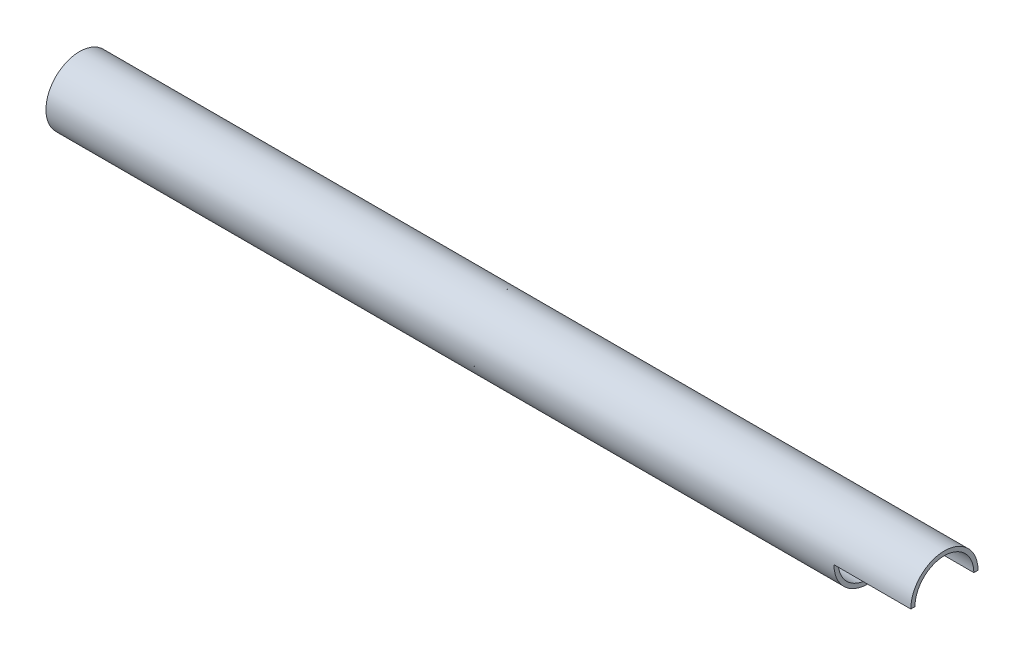
ISO-10303-21;
HEADER;
FILE_DESCRIPTION(('STEP AP214'),'2;1');
FILE_NAME('part.step','',(''),(''),'','','');
FILE_SCHEMA(('AUTOMOTIVE_DESIGN { 1 0 10303 214 1 1 1 1 }'));
ENDSEC;
DATA;
#1=APPLICATION_CONTEXT('core data for automotive mechanical design processes');
#2=APPLICATION_PROTOCOL_DEFINITION('international standard','automotive_design',2000,#1);
#3=PRODUCT_CONTEXT('',#1,'mechanical');
#4=PRODUCT('Part','Part','',(#3));
#5=PRODUCT_RELATED_PRODUCT_CATEGORY('part','',(#4));
#6=PRODUCT_DEFINITION_FORMATION('','',#4);
#7=PRODUCT_DEFINITION_CONTEXT('part definition',#1,'design');
#8=PRODUCT_DEFINITION('design','',#6,#7);
#9=PRODUCT_DEFINITION_SHAPE('','',#8);
#10=(LENGTH_UNIT() NAMED_UNIT(*) SI_UNIT(.MILLI.,.METRE.));
#11=(NAMED_UNIT(*) PLANE_ANGLE_UNIT() SI_UNIT($,.RADIAN.));
#12=(NAMED_UNIT(*) SI_UNIT($,.STERADIAN.) SOLID_ANGLE_UNIT());
#13=UNCERTAINTY_MEASURE_WITH_UNIT(LENGTH_MEASURE(1.E-05),#10,'distance_accuracy_value','');
#14=(GEOMETRIC_REPRESENTATION_CONTEXT(3) GLOBAL_UNCERTAINTY_ASSIGNED_CONTEXT((#13)) GLOBAL_UNIT_ASSIGNED_CONTEXT((#10,
#11,#12)) REPRESENTATION_CONTEXT('',''));
#15=CARTESIAN_POINT('',(0.,0.,0.));
#16=DIRECTION('',(0.,0.,1.));
#17=DIRECTION('',(1.,0.,0.));
#18=AXIS2_PLACEMENT_3D('',#15,#16,#17);
#19=CARTESIAN_POINT('',(1144.,0.,0.));
#20=DIRECTION('',(1.,0.,0.));
#21=DIRECTION('',(0.,0.,-1.));
#22=AXIS2_PLACEMENT_3D('',#19,#20,#21);
#23=PLANE('',#22);
#24=CARTESIAN_POINT('',(1144.,0.,0.));
#25=DIRECTION('',(1.,0.,0.));
#26=DIRECTION('',(0.,0.,-1.));
#27=AXIS2_PLACEMENT_3D('',#24,#25,#26);
#28=CIRCLE('',#27,38.95);
#29=CARTESIAN_POINT('',(1144.,0.,-38.95));
#30=VERTEX_POINT('',#29);
#31=CARTESIAN_POINT('',(1144.,0.,38.95));
#32=VERTEX_POINT('',#31);
#33=EDGE_CURVE('E93',#30,#32,#28,.T.);
#34=ORIENTED_EDGE('',*,*,#33,.F.);
#35=DIRECTION('',(0.,0.,-1.));
#36=VECTOR('',#35,1.);
#37=CARTESIAN_POINT('',(1144.,0.,0.));
#38=LINE('',#37,#36);
#39=CARTESIAN_POINT('',(1144.,0.,-44.45));
#40=VERTEX_POINT('',#39);
#41=EDGE_CURVE('E108',#30,#40,#38,.T.);
#42=ORIENTED_EDGE('',*,*,#41,.T.);
#43=CARTESIAN_POINT('',(1144.,0.,0.));
#44=DIRECTION('',(1.,0.,0.));
#45=DIRECTION('',(0.,0.,-1.));
#46=AXIS2_PLACEMENT_3D('',#43,#44,#45);
#47=CIRCLE('',#46,44.45);
#48=CARTESIAN_POINT('',(1144.,0.,44.45));
#49=VERTEX_POINT('',#48);
#50=EDGE_CURVE('E11',#40,#49,#47,.T.);
#51=ORIENTED_EDGE('',*,*,#50,.T.);
#52=DIRECTION('',(0.,0.,-1.));
#53=VECTOR('',#52,1.);
#54=CARTESIAN_POINT('',(1144.,0.,0.));
#55=LINE('',#54,#53);
#56=EDGE_CURVE('E106',#49,#32,#55,.T.);
#57=ORIENTED_EDGE('',*,*,#56,.T.);
#58=EDGE_LOOP('',(#34,#42,#51,#57));
#59=FACE_BOUND('',#58,.T.);
#60=ADVANCED_FACE('F33',(#59),#23,.T.);
#61=CARTESIAN_POINT('',(1144.,0.,0.));
#62=DIRECTION('',(-1.,0.,0.));
#63=DIRECTION('',(0.,0.,1.));
#64=AXIS2_PLACEMENT_3D('',#61,#62,#63);
#65=CYLINDRICAL_SURFACE('',#64,44.45);
#66=CARTESIAN_POINT('',(0.,0.,0.));
#67=DIRECTION('',(1.,0.,0.));
#68=DIRECTION('',(0.,0.,-1.));
#69=AXIS2_PLACEMENT_3D('',#66,#67,#68);
#70=CIRCLE('',#69,44.45);
#71=CARTESIAN_POINT('',(0.,0.,-44.45));
#72=VERTEX_POINT('',#71);
#73=EDGE_CURVE('E37',#72,#72,#70,.T.);
#74=ORIENTED_EDGE('',*,*,#73,.T.);
#75=EDGE_LOOP('',(#74));
#76=FACE_BOUND('',#75,.T.);
#77=DIRECTION('',(1.,0.,0.));
#78=VECTOR('',#77,1.);
#79=CARTESIAN_POINT('',(1042.4,0.,-44.45));
#80=LINE('',#79,#78);
#81=CARTESIAN_POINT('',(1042.4,0.,-44.45));
#82=VERTEX_POINT('',#81);
#83=EDGE_CURVE('E69',#82,#40,#80,.T.);
#84=ORIENTED_EDGE('',*,*,#83,.F.);
#85=CARTESIAN_POINT('',(1042.4,0.,0.));
#86=DIRECTION('',(1.,0.,0.));
#87=DIRECTION('',(0.,0.,-1.));
#88=AXIS2_PLACEMENT_3D('',#85,#86,#87);
#89=CIRCLE('',#88,44.45);
#90=CARTESIAN_POINT('',(1042.4,0.,44.45));
#91=VERTEX_POINT('',#90);
#92=EDGE_CURVE('E82',#91,#82,#89,.T.);
#93=ORIENTED_EDGE('',*,*,#92,.F.);
#94=DIRECTION('',(1.,0.,0.));
#95=VECTOR('',#94,1.);
#96=CARTESIAN_POINT('',(1042.4,0.,44.45));
#97=LINE('',#96,#95);
#98=EDGE_CURVE('E80',#91,#49,#97,.T.);
#99=ORIENTED_EDGE('',*,*,#98,.T.);
#100=ORIENTED_EDGE('',*,*,#50,.F.);
#101=EDGE_LOOP('',(#84,#93,#99,#100));
#102=FACE_BOUND('',#101,.T.);
#103=ADVANCED_FACE('F35',(#76,#102),#65,.T.);
#104=CARTESIAN_POINT('',(1144.,0.,0.));
#105=DIRECTION('',(-1.,0.,0.));
#106=DIRECTION('',(0.,0.,1.));
#107=AXIS2_PLACEMENT_3D('',#104,#105,#106);
#108=CYLINDRICAL_SURFACE('',#107,38.95);
#109=CARTESIAN_POINT('',(0.,0.,0.));
#110=DIRECTION('',(1.,0.,0.));
#111=DIRECTION('',(0.,0.,-1.));
#112=AXIS2_PLACEMENT_3D('',#109,#110,#111);
#113=CIRCLE('',#112,38.95);
#114=CARTESIAN_POINT('',(0.,0.,-38.95));
#115=VERTEX_POINT('',#114);
#116=EDGE_CURVE('E101',#115,#115,#113,.T.);
#117=ORIENTED_EDGE('',*,*,#116,.F.);
#118=EDGE_LOOP('',(#117));
#119=FACE_BOUND('',#118,.T.);
#120=CARTESIAN_POINT('',(1042.4,0.,0.));
#121=DIRECTION('',(1.,0.,0.));
#122=DIRECTION('',(0.,0.,-1.));
#123=AXIS2_PLACEMENT_3D('',#120,#121,#122);
#124=CIRCLE('',#123,38.95);
#125=CARTESIAN_POINT('',(1042.4,0.,-38.95));
#126=VERTEX_POINT('',#125);
#127=CARTESIAN_POINT('',(1042.4,0.,38.95));
#128=VERTEX_POINT('',#127);
#129=EDGE_CURVE('E83',#126,#128,#124,.F.);
#130=ORIENTED_EDGE('',*,*,#129,.F.);
#131=DIRECTION('',(1.,0.,0.));
#132=VECTOR('',#131,1.);
#133=CARTESIAN_POINT('',(1042.4,0.,-38.95));
#134=LINE('',#133,#132);
#135=EDGE_CURVE('E94',#126,#30,#134,.T.);
#136=ORIENTED_EDGE('',*,*,#135,.T.);
#137=ORIENTED_EDGE('',*,*,#33,.T.);
#138=DIRECTION('',(1.,0.,0.));
#139=VECTOR('',#138,1.);
#140=CARTESIAN_POINT('',(1042.4,0.,38.95));
#141=LINE('',#140,#139);
#142=EDGE_CURVE('E77',#128,#32,#141,.T.);
#143=ORIENTED_EDGE('',*,*,#142,.F.);
#144=EDGE_LOOP('',(#130,#136,#137,#143));
#145=FACE_BOUND('',#144,.T.);
#146=ADVANCED_FACE('F91',(#119,#145),#108,.F.);
#147=CARTESIAN_POINT('',(0.,0.,0.));
#148=DIRECTION('',(1.,0.,0.));
#149=DIRECTION('',(0.,0.,-1.));
#150=AXIS2_PLACEMENT_3D('',#147,#148,#149);
#151=PLANE('',#150);
#152=ORIENTED_EDGE('',*,*,#73,.F.);
#153=EDGE_LOOP('',(#152));
#154=FACE_BOUND('',#153,.T.);
#155=ORIENTED_EDGE('',*,*,#116,.T.);
#156=EDGE_LOOP('',(#155));
#157=FACE_BOUND('',#156,.T.);
#158=ADVANCED_FACE('F116',(#154,#157),#151,.F.);
#159=CARTESIAN_POINT('',(1042.4,0.,0.));
#160=DIRECTION('',(0.,-1.,0.));
#161=DIRECTION('',(0.,0.,-1.));
#162=AXIS2_PLACEMENT_3D('',#159,#160,#161);
#163=PLANE('',#162);
#164=ORIENTED_EDGE('',*,*,#41,.F.);
#165=ORIENTED_EDGE('',*,*,#135,.F.);
#166=DIRECTION('',(0.,0.,-1.));
#167=VECTOR('',#166,1.);
#168=CARTESIAN_POINT('',(1042.4,0.,0.));
#169=LINE('',#168,#167);
#170=EDGE_CURVE('E48',#126,#82,#169,.T.);
#171=ORIENTED_EDGE('',*,*,#170,.T.);
#172=ORIENTED_EDGE('',*,*,#83,.T.);
#173=EDGE_LOOP('',(#164,#165,#171,#172));
#174=FACE_BOUND('',#173,.T.);
#175=ADVANCED_FACE('F114',(#174),#163,.T.);
#176=CARTESIAN_POINT('',(1042.4,0.,0.));
#177=DIRECTION('',(0.,-1.,0.));
#178=DIRECTION('',(0.,0.,-1.));
#179=AXIS2_PLACEMENT_3D('',#176,#177,#178);
#180=PLANE('',#179);
#181=ORIENTED_EDGE('',*,*,#56,.F.);
#182=ORIENTED_EDGE('',*,*,#98,.F.);
#183=DIRECTION('',(0.,0.,-1.));
#184=VECTOR('',#183,1.);
#185=CARTESIAN_POINT('',(1042.4,0.,0.));
#186=LINE('',#185,#184);
#187=EDGE_CURVE('E74',#91,#128,#186,.T.);
#188=ORIENTED_EDGE('',*,*,#187,.T.);
#189=ORIENTED_EDGE('',*,*,#142,.T.);
#190=EDGE_LOOP('',(#181,#182,#188,#189));
#191=FACE_BOUND('',#190,.T.);
#192=ADVANCED_FACE('F75',(#191),#180,.T.);
#193=CARTESIAN_POINT('',(1042.4,0.,0.));
#194=DIRECTION('',(1.,0.,0.));
#195=DIRECTION('',(0.,0.,-1.));
#196=AXIS2_PLACEMENT_3D('',#193,#194,#195);
#197=PLANE('',#196);
#198=ORIENTED_EDGE('',*,*,#170,.F.);
#199=ORIENTED_EDGE('',*,*,#129,.T.);
#200=ORIENTED_EDGE('',*,*,#187,.F.);
#201=ORIENTED_EDGE('',*,*,#92,.T.);
#202=EDGE_LOOP('',(#198,#199,#200,#201));
#203=FACE_BOUND('',#202,.T.);
#204=ADVANCED_FACE('F86',(#203),#197,.T.);
#205=CLOSED_SHELL('',(#60,#103,#146,#158,#175,#192,#204));
#206=MANIFOLD_SOLID_BREP('B2',#205);
#207=ADVANCED_BREP_SHAPE_REPRESENTATION('',(#18,#206),#14);
#208=SHAPE_DEFINITION_REPRESENTATION(#9,#207);
ENDSEC;
END-ISO-10303-21;
